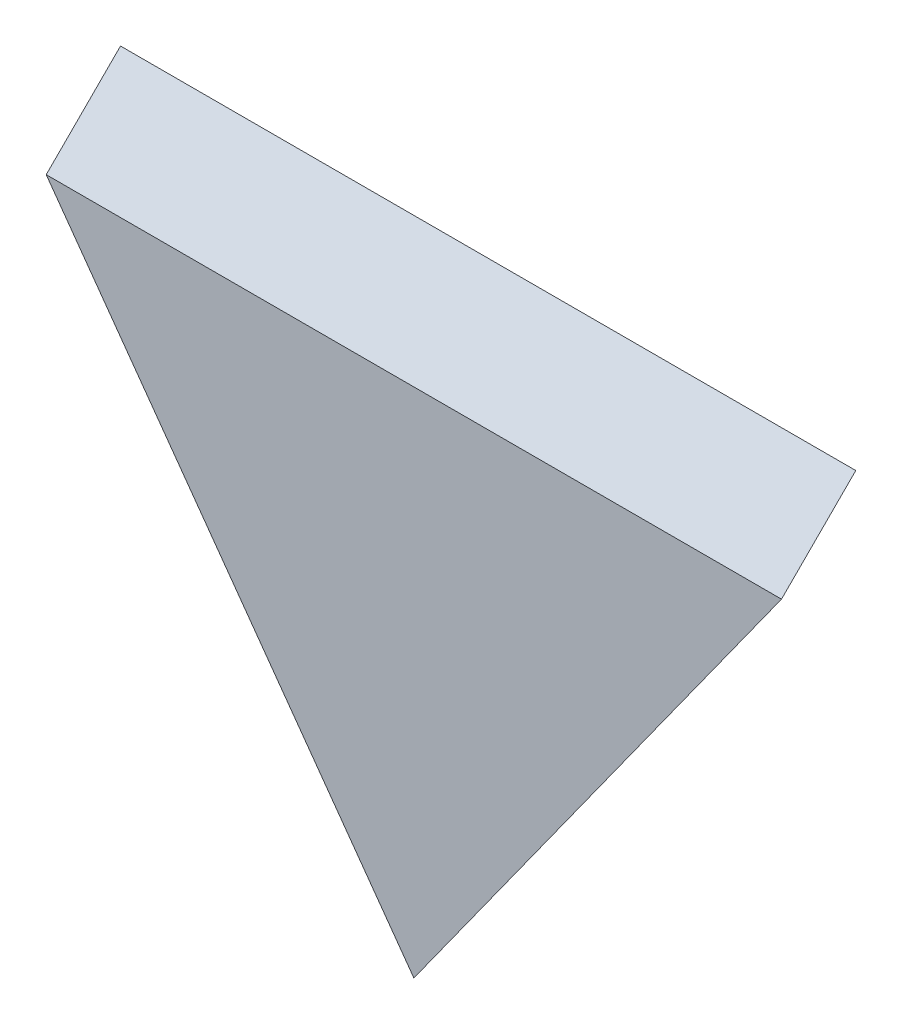
ISO-10303-21;
HEADER;
FILE_DESCRIPTION(('STEP AP214'),'2;1');
FILE_NAME('part.step','',(''),(''),'','','');
FILE_SCHEMA(('AUTOMOTIVE_DESIGN { 1 0 10303 214 1 1 1 1 }'));
ENDSEC;
DATA;
#1=APPLICATION_CONTEXT('core data for automotive mechanical design processes');
#2=APPLICATION_PROTOCOL_DEFINITION('international standard','automotive_design',2000,#1);
#3=PRODUCT_CONTEXT('',#1,'mechanical');
#4=PRODUCT('Part','Part','',(#3));
#5=PRODUCT_RELATED_PRODUCT_CATEGORY('part','',(#4));
#6=PRODUCT_DEFINITION_FORMATION('','',#4);
#7=PRODUCT_DEFINITION_CONTEXT('part definition',#1,'design');
#8=PRODUCT_DEFINITION('design','',#6,#7);
#9=PRODUCT_DEFINITION_SHAPE('','',#8);
#10=(LENGTH_UNIT() NAMED_UNIT(*) SI_UNIT(.MILLI.,.METRE.));
#11=(NAMED_UNIT(*) PLANE_ANGLE_UNIT() SI_UNIT($,.RADIAN.));
#12=(NAMED_UNIT(*) SI_UNIT($,.STERADIAN.) SOLID_ANGLE_UNIT());
#13=UNCERTAINTY_MEASURE_WITH_UNIT(LENGTH_MEASURE(1.E-05),#10,'distance_accuracy_value','');
#14=(GEOMETRIC_REPRESENTATION_CONTEXT(3) GLOBAL_UNCERTAINTY_ASSIGNED_CONTEXT((#13)) GLOBAL_UNIT_ASSIGNED_CONTEXT((#10,
#11,#12)) REPRESENTATION_CONTEXT('',''));
#15=CARTESIAN_POINT('',(0.,0.,0.));
#16=DIRECTION('',(0.,0.,1.));
#17=DIRECTION('',(1.,0.,0.));
#18=AXIS2_PLACEMENT_3D('',#15,#16,#17);
#19=CARTESIAN_POINT('',(0.,0.,0.));
#20=DIRECTION('',(0.,0.,-1.));
#21=DIRECTION('',(-1.,0.,0.));
#22=AXIS2_PLACEMENT_3D('',#19,#20,#21);
#23=PLANE('',#22);
#24=DIRECTION('',(0.583333333333333,-0.812232862067414,0.));
#25=VECTOR('',#24,1.);
#26=CARTESIAN_POINT('',(0.,0.,0.));
#27=LINE('',#26,#25);
#28=CARTESIAN_POINT('',(-44.45,61.8921440895369,0.));
#29=VERTEX_POINT('',#28);
#30=CARTESIAN_POINT('',(0.,0.,0.));
#31=VERTEX_POINT('',#30);
#32=EDGE_CURVE('E70',#29,#31,#27,.T.);
#33=ORIENTED_EDGE('',*,*,#32,.T.);
#34=DIRECTION('',(0.583333333333333,0.812232862067414,0.));
#35=VECTOR('',#34,1.);
#36=CARTESIAN_POINT('',(0.,0.,0.));
#37=LINE('',#36,#35);
#38=CARTESIAN_POINT('',(44.45,61.8921440895369,0.));
#39=VERTEX_POINT('',#38);
#40=EDGE_CURVE('E66',#31,#39,#37,.T.);
#41=ORIENTED_EDGE('',*,*,#40,.T.);
#42=DIRECTION('',(-1.,0.,0.));
#43=VECTOR('',#42,1.);
#44=CARTESIAN_POINT('',(44.45,61.8921440895369,0.));
#45=LINE('',#44,#43);
#46=EDGE_CURVE('E74',#39,#29,#45,.T.);
#47=ORIENTED_EDGE('',*,*,#46,.T.);
#48=EDGE_LOOP('',(#33,#41,#47));
#49=FACE_BOUND('',#48,.T.);
#50=ADVANCED_FACE('F33',(#49),#23,.F.);
#51=CARTESIAN_POINT('',(0.,8.98025612106917,-8.98025612106914));
#52=DIRECTION('',(0.,0.,-1.));
#53=DIRECTION('',(-1.,0.,0.));
#54=AXIS2_PLACEMENT_3D('',#51,#52,#53);
#55=PLANE('',#54);
#56=DIRECTION('',(0.583333333333333,-0.812232862067414,0.));
#57=VECTOR('',#56,1.);
#58=CARTESIAN_POINT('',(0.,8.98025612106917,-8.98025612106914));
#59=LINE('',#58,#57);
#60=CARTESIAN_POINT('',(-44.45,70.8724002106061,-8.98025612106914));
#61=VERTEX_POINT('',#60);
#62=CARTESIAN_POINT('',(0.,8.98025612106917,-8.98025612106914));
#63=VERTEX_POINT('',#62);
#64=EDGE_CURVE('E47',#61,#63,#59,.T.);
#65=ORIENTED_EDGE('',*,*,#64,.F.);
#66=DIRECTION('',(-1.,0.,0.));
#67=VECTOR('',#66,1.);
#68=CARTESIAN_POINT('',(44.45,70.8724002106061,-8.98025612106914));
#69=LINE('',#68,#67);
#70=CARTESIAN_POINT('',(44.45,70.8724002106061,-8.98025612106914));
#71=VERTEX_POINT('',#70);
#72=EDGE_CURVE('E56',#71,#61,#69,.T.);
#73=ORIENTED_EDGE('',*,*,#72,.F.);
#74=DIRECTION('',(0.583333333333333,0.812232862067414,0.));
#75=VECTOR('',#74,1.);
#76=CARTESIAN_POINT('',(0.,8.98025612106917,-8.98025612106914));
#77=LINE('',#76,#75);
#78=EDGE_CURVE('E11',#63,#71,#77,.T.);
#79=ORIENTED_EDGE('',*,*,#78,.F.);
#80=EDGE_LOOP('',(#65,#73,#79));
#81=FACE_BOUND('',#80,.T.);
#82=ADVANCED_FACE('F95',(#81),#55,.T.);
#83=CARTESIAN_POINT('',(44.45,61.8921440895369,0.));
#84=DIRECTION('',(0.,-0.707106781186546,-0.707106781186549));
#85=DIRECTION('',(0.,0.707106781186549,-0.707106781186546));
#86=AXIS2_PLACEMENT_3D('',#83,#84,#85);
#87=PLANE('',#86);
#88=DIRECTION('',(0.,0.707106781186549,-0.707106781186546));
#89=VECTOR('',#88,1.);
#90=CARTESIAN_POINT('',(-44.45,61.8921440895369,0.));
#91=LINE('',#90,#89);
#92=EDGE_CURVE('E77',#29,#61,#91,.T.);
#93=ORIENTED_EDGE('',*,*,#92,.F.);
#94=ORIENTED_EDGE('',*,*,#46,.F.);
#95=DIRECTION('',(0.,0.707106781186549,-0.707106781186546));
#96=VECTOR('',#95,1.);
#97=CARTESIAN_POINT('',(44.45,61.8921440895369,0.));
#98=LINE('',#97,#96);
#99=EDGE_CURVE('E76',#39,#71,#98,.T.);
#100=ORIENTED_EDGE('',*,*,#99,.T.);
#101=ORIENTED_EDGE('',*,*,#72,.T.);
#102=EDGE_LOOP('',(#93,#94,#100,#101));
#103=FACE_BOUND('',#102,.T.);
#104=ADVANCED_FACE('F75',(#103),#87,.F.);
#105=CARTESIAN_POINT('',(0.,0.,0.));
#106=DIRECTION('',(0.701589608870179,0.503871025524086,0.503871025524087));
#107=DIRECTION('',(0.583333333333335,0.,-0.812232862067413));
#108=AXIS2_PLACEMENT_3D('',#105,#106,#107);
#109=PLANE('',#108);
#110=DIRECTION('',(0.,0.707106781186549,-0.707106781186546));
#111=VECTOR('',#110,1.);
#112=CARTESIAN_POINT('',(0.,0.,0.));
#113=LINE('',#112,#111);
#114=EDGE_CURVE('E40',#31,#63,#113,.T.);
#115=ORIENTED_EDGE('',*,*,#114,.F.);
#116=ORIENTED_EDGE('',*,*,#32,.F.);
#117=ORIENTED_EDGE('',*,*,#92,.T.);
#118=ORIENTED_EDGE('',*,*,#64,.T.);
#119=EDGE_LOOP('',(#115,#116,#117,#118));
#120=FACE_BOUND('',#119,.T.);
#121=ADVANCED_FACE('F87',(#120),#109,.F.);
#122=CARTESIAN_POINT('',(0.,0.,0.));
#123=DIRECTION('',(-0.701589608870179,0.503871025524086,0.503871025524087));
#124=DIRECTION('',(0.583333333333335,0.,0.812232862067413));
#125=AXIS2_PLACEMENT_3D('',#122,#123,#124);
#126=PLANE('',#125);
#127=ORIENTED_EDGE('',*,*,#78,.T.);
#128=ORIENTED_EDGE('',*,*,#99,.F.);
#129=ORIENTED_EDGE('',*,*,#40,.F.);
#130=ORIENTED_EDGE('',*,*,#114,.T.);
#131=EDGE_LOOP('',(#127,#128,#129,#130));
#132=FACE_BOUND('',#131,.T.);
#133=ADVANCED_FACE('F80',(#132),#126,.F.);
#134=CLOSED_SHELL('',(#50,#82,#104,#121,#133));
#135=MANIFOLD_SOLID_BREP('B2',#134);
#136=ADVANCED_BREP_SHAPE_REPRESENTATION('',(#18,#135),#14);
#137=SHAPE_DEFINITION_REPRESENTATION(#9,#136);
ENDSEC;
END-ISO-10303-21;
